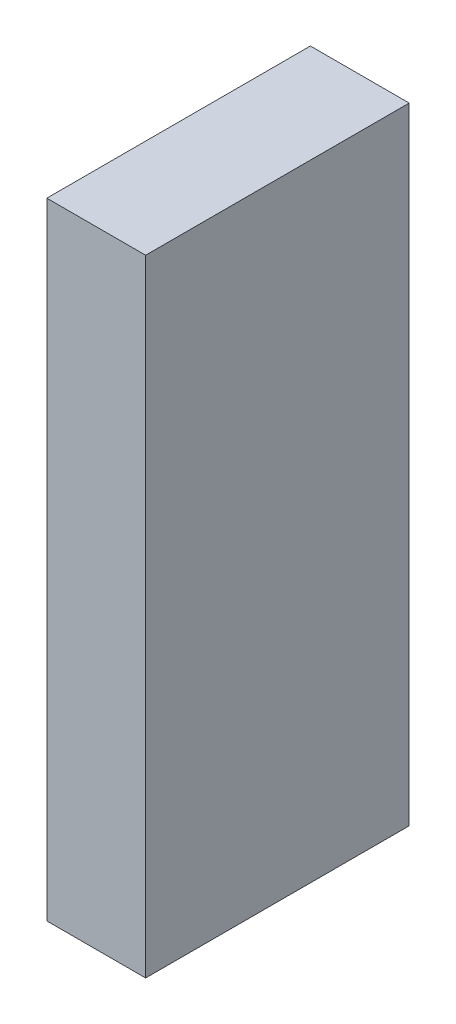
ISO-10303-21;
HEADER;
FILE_DESCRIPTION(('STEP AP214'),'2;1');
FILE_NAME('part.step','',(''),(''),'','','');
FILE_SCHEMA(('AUTOMOTIVE_DESIGN { 1 0 10303 214 1 1 1 1 }'));
ENDSEC;
DATA;
#1=APPLICATION_CONTEXT('core data for automotive mechanical design processes');
#2=APPLICATION_PROTOCOL_DEFINITION('international standard','automotive_design',2000,#1);
#3=PRODUCT_CONTEXT('',#1,'mechanical');
#4=PRODUCT('Part','Part','',(#3));
#5=PRODUCT_RELATED_PRODUCT_CATEGORY('part','',(#4));
#6=PRODUCT_DEFINITION_FORMATION('','',#4);
#7=PRODUCT_DEFINITION_CONTEXT('part definition',#1,'design');
#8=PRODUCT_DEFINITION('design','',#6,#7);
#9=PRODUCT_DEFINITION_SHAPE('','',#8);
#10=(LENGTH_UNIT() NAMED_UNIT(*) SI_UNIT(.MILLI.,.METRE.));
#11=(NAMED_UNIT(*) PLANE_ANGLE_UNIT() SI_UNIT($,.RADIAN.));
#12=(NAMED_UNIT(*) SI_UNIT($,.STERADIAN.) SOLID_ANGLE_UNIT());
#13=UNCERTAINTY_MEASURE_WITH_UNIT(LENGTH_MEASURE(1.E-05),#10,'distance_accuracy_value','');
#14=(GEOMETRIC_REPRESENTATION_CONTEXT(3) GLOBAL_UNCERTAINTY_ASSIGNED_CONTEXT((#13)) GLOBAL_UNIT_ASSIGNED_CONTEXT((#10,
#11,#12)) REPRESENTATION_CONTEXT('',''));
#15=CARTESIAN_POINT('',(0.,0.,0.));
#16=DIRECTION('',(0.,0.,1.));
#17=DIRECTION('',(1.,0.,0.));
#18=AXIS2_PLACEMENT_3D('',#15,#16,#17);
#19=CARTESIAN_POINT('',(15.,28.258064516129,20.1290322580645));
#20=DIRECTION('',(0.,0.,-1.));
#21=DIRECTION('',(0.,1.,0.));
#22=AXIS2_PLACEMENT_3D('',#19,#20,#21);
#23=PLANE('',#22);
#24=DIRECTION('',(0.,-1.,0.));
#25=VECTOR('',#24,1.);
#26=CARTESIAN_POINT('',(0.,28.258064516129,20.1290322580645));
#27=LINE('',#26,#25);
#28=CARTESIAN_POINT('',(0.,28.258064516129,20.1290322580645));
#29=VERTEX_POINT('',#28);
#30=CARTESIAN_POINT('',(0.,-66.741935483871,20.1290322580645));
#31=VERTEX_POINT('',#30);
#32=EDGE_CURVE('E107',#29,#31,#27,.T.);
#33=ORIENTED_EDGE('',*,*,#32,.T.);
#34=DIRECTION('',(-1.,0.,0.));
#35=VECTOR('',#34,1.);
#36=CARTESIAN_POINT('',(15.,-66.741935483871,20.1290322580645));
#37=LINE('',#36,#35);
#38=CARTESIAN_POINT('',(15.,-66.741935483871,20.1290322580645));
#39=VERTEX_POINT('',#38);
#40=EDGE_CURVE('E11',#39,#31,#37,.T.);
#41=ORIENTED_EDGE('',*,*,#40,.F.);
#42=DIRECTION('',(0.,-1.,0.));
#43=VECTOR('',#42,1.);
#44=CARTESIAN_POINT('',(15.,28.258064516129,20.1290322580645));
#45=LINE('',#44,#43);
#46=CARTESIAN_POINT('',(15.,28.258064516129,20.1290322580645));
#47=VERTEX_POINT('',#46);
#48=EDGE_CURVE('E91',#47,#39,#45,.T.);
#49=ORIENTED_EDGE('',*,*,#48,.F.);
#50=DIRECTION('',(-1.,0.,0.));
#51=VECTOR('',#50,1.);
#52=CARTESIAN_POINT('',(15.,28.258064516129,20.1290322580645));
#53=LINE('',#52,#51);
#54=EDGE_CURVE('E103',#47,#29,#53,.T.);
#55=ORIENTED_EDGE('',*,*,#54,.T.);
#56=EDGE_LOOP('',(#33,#41,#49,#55));
#57=FACE_BOUND('',#56,.T.);
#58=ADVANCED_FACE('F39',(#57),#23,.F.);
#59=CARTESIAN_POINT('',(15.,-66.741935483871,20.1290322580645));
#60=DIRECTION('',(0.,1.,0.));
#61=DIRECTION('',(0.,0.,1.));
#62=AXIS2_PLACEMENT_3D('',#59,#60,#61);
#63=PLANE('',#62);
#64=DIRECTION('',(0.,0.,-1.));
#65=VECTOR('',#64,1.);
#66=CARTESIAN_POINT('',(0.,-66.741935483871,20.1290322580645));
#67=LINE('',#66,#65);
#68=CARTESIAN_POINT('',(0.,-66.741935483871,-19.8709677419355));
#69=VERTEX_POINT('',#68);
#70=EDGE_CURVE('E96',#31,#69,#67,.T.);
#71=ORIENTED_EDGE('',*,*,#70,.T.);
#72=DIRECTION('',(-1.,0.,0.));
#73=VECTOR('',#72,1.);
#74=CARTESIAN_POINT('',(15.,-66.741935483871,-19.8709677419355));
#75=LINE('',#74,#73);
#76=CARTESIAN_POINT('',(15.,-66.741935483871,-19.8709677419355));
#77=VERTEX_POINT('',#76);
#78=EDGE_CURVE('E48',#77,#69,#75,.T.);
#79=ORIENTED_EDGE('',*,*,#78,.F.);
#80=DIRECTION('',(0.,0.,-1.));
#81=VECTOR('',#80,1.);
#82=CARTESIAN_POINT('',(15.,-66.741935483871,20.1290322580645));
#83=LINE('',#82,#81);
#84=EDGE_CURVE('E86',#39,#77,#83,.T.);
#85=ORIENTED_EDGE('',*,*,#84,.F.);
#86=ORIENTED_EDGE('',*,*,#40,.T.);
#87=EDGE_LOOP('',(#71,#79,#85,#86));
#88=FACE_BOUND('',#87,.T.);
#89=ADVANCED_FACE('F95',(#88),#63,.F.);
#90=CARTESIAN_POINT('',(15.,28.258064516129,-19.8709677419355));
#91=DIRECTION('',(0.,0.,1.));
#92=DIRECTION('',(0.,-1.,0.));
#93=AXIS2_PLACEMENT_3D('',#90,#91,#92);
#94=PLANE('',#93);
#95=DIRECTION('',(0.,1.,0.));
#96=VECTOR('',#95,1.);
#97=CARTESIAN_POINT('',(0.,28.258064516129,-19.8709677419355));
#98=LINE('',#97,#96);
#99=CARTESIAN_POINT('',(0.,28.258064516129,-19.8709677419355));
#100=VERTEX_POINT('',#99);
#101=EDGE_CURVE('E73',#69,#100,#98,.T.);
#102=ORIENTED_EDGE('',*,*,#101,.T.);
#103=DIRECTION('',(-1.,0.,0.));
#104=VECTOR('',#103,1.);
#105=CARTESIAN_POINT('',(15.,28.258064516129,-19.8709677419355));
#106=LINE('',#105,#104);
#107=CARTESIAN_POINT('',(15.,28.258064516129,-19.8709677419355));
#108=VERTEX_POINT('',#107);
#109=EDGE_CURVE('E98',#108,#100,#106,.T.);
#110=ORIENTED_EDGE('',*,*,#109,.F.);
#111=DIRECTION('',(0.,1.,0.));
#112=VECTOR('',#111,1.);
#113=CARTESIAN_POINT('',(15.,28.258064516129,-19.8709677419355));
#114=LINE('',#113,#112);
#115=EDGE_CURVE('E89',#77,#108,#114,.T.);
#116=ORIENTED_EDGE('',*,*,#115,.F.);
#117=ORIENTED_EDGE('',*,*,#78,.T.);
#118=EDGE_LOOP('',(#102,#110,#116,#117));
#119=FACE_BOUND('',#118,.T.);
#120=ADVANCED_FACE('F99',(#119),#94,.F.);
#121=CARTESIAN_POINT('',(15.,28.258064516129,20.1290322580645));
#122=DIRECTION('',(0.,-1.,0.));
#123=DIRECTION('',(0.,0.,-1.));
#124=AXIS2_PLACEMENT_3D('',#121,#122,#123);
#125=PLANE('',#124);
#126=DIRECTION('',(0.,0.,1.));
#127=VECTOR('',#126,1.);
#128=CARTESIAN_POINT('',(0.,28.258064516129,20.1290322580645));
#129=LINE('',#128,#127);
#130=EDGE_CURVE('E79',#100,#29,#129,.T.);
#131=ORIENTED_EDGE('',*,*,#130,.T.);
#132=ORIENTED_EDGE('',*,*,#54,.F.);
#133=DIRECTION('',(0.,0.,1.));
#134=VECTOR('',#133,1.);
#135=CARTESIAN_POINT('',(15.,28.258064516129,20.1290322580645));
#136=LINE('',#135,#134);
#137=EDGE_CURVE('E56',#108,#47,#136,.T.);
#138=ORIENTED_EDGE('',*,*,#137,.F.);
#139=ORIENTED_EDGE('',*,*,#109,.T.);
#140=EDGE_LOOP('',(#131,#132,#138,#139));
#141=FACE_BOUND('',#140,.T.);
#142=ADVANCED_FACE('F120',(#141),#125,.F.);
#143=CARTESIAN_POINT('',(15.,0.,0.));
#144=DIRECTION('',(1.,0.,0.));
#145=DIRECTION('',(0.,0.,-1.));
#146=AXIS2_PLACEMENT_3D('',#143,#144,#145);
#147=PLANE('',#146);
#148=ORIENTED_EDGE('',*,*,#48,.T.);
#149=ORIENTED_EDGE('',*,*,#84,.T.);
#150=ORIENTED_EDGE('',*,*,#115,.T.);
#151=ORIENTED_EDGE('',*,*,#137,.T.);
#152=EDGE_LOOP('',(#148,#149,#150,#151));
#153=FACE_BOUND('',#152,.T.);
#154=ADVANCED_FACE('F87',(#153),#147,.T.);
#155=CARTESIAN_POINT('',(0.,0.,0.));
#156=DIRECTION('',(1.,0.,0.));
#157=DIRECTION('',(0.,0.,-1.));
#158=AXIS2_PLACEMENT_3D('',#155,#156,#157);
#159=PLANE('',#158);
#160=ORIENTED_EDGE('',*,*,#32,.F.);
#161=ORIENTED_EDGE('',*,*,#130,.F.);
#162=ORIENTED_EDGE('',*,*,#101,.F.);
#163=ORIENTED_EDGE('',*,*,#70,.F.);
#164=EDGE_LOOP('',(#160,#161,#162,#163));
#165=FACE_BOUND('',#164,.T.);
#166=ADVANCED_FACE('F123',(#165),#159,.F.);
#167=CLOSED_SHELL('',(#58,#89,#120,#142,#154,#166));
#168=MANIFOLD_SOLID_BREP('B2',#167);
#169=ADVANCED_BREP_SHAPE_REPRESENTATION('',(#18,#168),#14);
#170=SHAPE_DEFINITION_REPRESENTATION(#9,#169);
ENDSEC;
END-ISO-10303-21;
